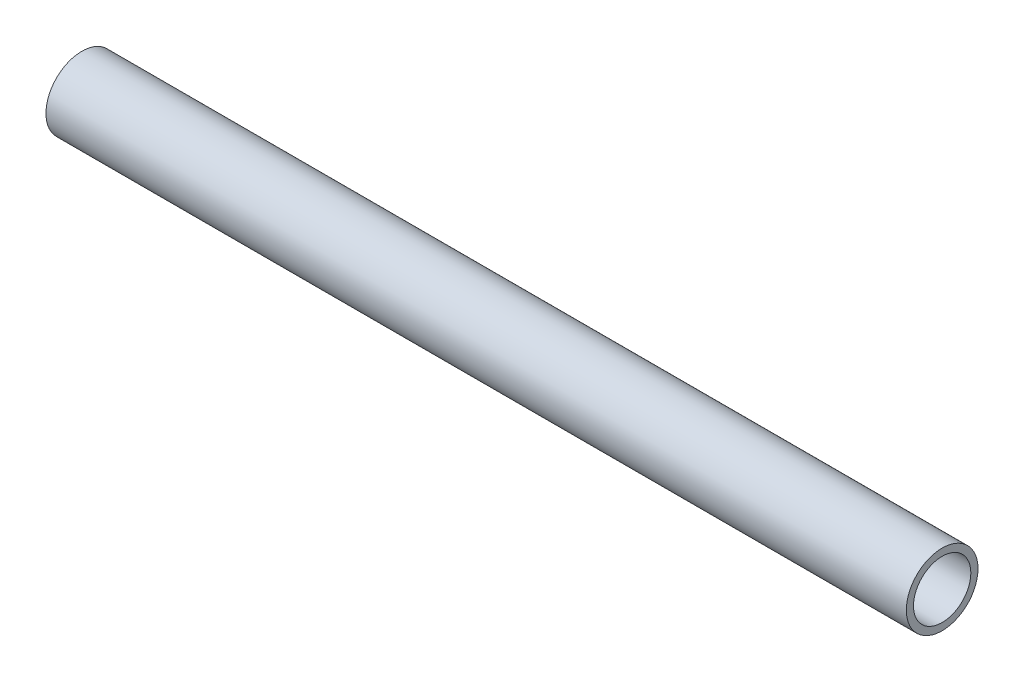
ISO-10303-21;
HEADER;
FILE_DESCRIPTION(('STEP AP214'),'2;1');
FILE_NAME('part.step','',(''),(''),'','','');
FILE_SCHEMA(('AUTOMOTIVE_DESIGN { 1 0 10303 214 1 1 1 1 }'));
ENDSEC;
DATA;
#1=APPLICATION_CONTEXT('core data for automotive mechanical design processes');
#2=APPLICATION_PROTOCOL_DEFINITION('international standard','automotive_design',2000,#1);
#3=PRODUCT_CONTEXT('',#1,'mechanical');
#4=PRODUCT('Part','Part','',(#3));
#5=PRODUCT_RELATED_PRODUCT_CATEGORY('part','',(#4));
#6=PRODUCT_DEFINITION_FORMATION('','',#4);
#7=PRODUCT_DEFINITION_CONTEXT('part definition',#1,'design');
#8=PRODUCT_DEFINITION('design','',#6,#7);
#9=PRODUCT_DEFINITION_SHAPE('','',#8);
#10=(LENGTH_UNIT() NAMED_UNIT(*) SI_UNIT(.MILLI.,.METRE.));
#11=(NAMED_UNIT(*) PLANE_ANGLE_UNIT() SI_UNIT($,.RADIAN.));
#12=(NAMED_UNIT(*) SI_UNIT($,.STERADIAN.) SOLID_ANGLE_UNIT());
#13=UNCERTAINTY_MEASURE_WITH_UNIT(LENGTH_MEASURE(1.E-05),#10,'distance_accuracy_value','');
#14=(GEOMETRIC_REPRESENTATION_CONTEXT(3) GLOBAL_UNCERTAINTY_ASSIGNED_CONTEXT((#13)) GLOBAL_UNIT_ASSIGNED_CONTEXT((#10,
#11,#12)) REPRESENTATION_CONTEXT('',''));
#15=CARTESIAN_POINT('',(0.,0.,0.));
#16=DIRECTION('',(0.,0.,1.));
#17=DIRECTION('',(1.,0.,0.));
#18=AXIS2_PLACEMENT_3D('',#15,#16,#17);
#19=CARTESIAN_POINT('',(0.,0.,0.));
#20=DIRECTION('',(1.,0.,0.));
#21=DIRECTION('',(0.,0.,-1.));
#22=AXIS2_PLACEMENT_3D('',#19,#20,#21);
#23=PLANE('',#22);
#24=CARTESIAN_POINT('',(0.,0.,0.));
#25=DIRECTION('',(1.,0.,0.));
#26=DIRECTION('',(0.,0.,-1.));
#27=AXIS2_PLACEMENT_3D('',#24,#25,#26);
#28=CIRCLE('',#27,4.);
#29=CARTESIAN_POINT('',(0.,0.,-4.));
#30=VERTEX_POINT('',#29);
#31=EDGE_CURVE('E57',#30,#30,#28,.T.);
#32=ORIENTED_EDGE('',*,*,#31,.T.);
#33=EDGE_LOOP('',(#32));
#34=FACE_BOUND('',#33,.T.);
#35=CARTESIAN_POINT('',(0.,0.,0.));
#36=DIRECTION('',(1.,0.,0.));
#37=DIRECTION('',(0.,0.,-1.));
#38=AXIS2_PLACEMENT_3D('',#35,#36,#37);
#39=CIRCLE('',#38,5.);
#40=CARTESIAN_POINT('',(0.,0.,-5.));
#41=VERTEX_POINT('',#40);
#42=EDGE_CURVE('E49',#41,#41,#39,.T.);
#43=ORIENTED_EDGE('',*,*,#42,.F.);
#44=EDGE_LOOP('',(#43));
#45=FACE_BOUND('',#44,.T.);
#46=ADVANCED_FACE('F43',(#34,#45),#23,.F.);
#47=CARTESIAN_POINT('',(120.,0.,0.));
#48=DIRECTION('',(1.,0.,0.));
#49=DIRECTION('',(0.,0.,-1.));
#50=AXIS2_PLACEMENT_3D('',#47,#48,#49);
#51=PLANE('',#50);
#52=CARTESIAN_POINT('',(120.,0.,0.));
#53=DIRECTION('',(1.,0.,0.));
#54=DIRECTION('',(0.,0.,-1.));
#55=AXIS2_PLACEMENT_3D('',#52,#53,#54);
#56=CIRCLE('',#55,4.);
#57=CARTESIAN_POINT('',(120.,0.,-4.));
#58=VERTEX_POINT('',#57);
#59=EDGE_CURVE('E53',#58,#58,#56,.T.);
#60=ORIENTED_EDGE('',*,*,#59,.F.);
#61=EDGE_LOOP('',(#60));
#62=FACE_BOUND('',#61,.T.);
#63=CARTESIAN_POINT('',(120.,0.,0.));
#64=DIRECTION('',(1.,0.,0.));
#65=DIRECTION('',(0.,0.,-1.));
#66=AXIS2_PLACEMENT_3D('',#63,#64,#65);
#67=CIRCLE('',#66,5.);
#68=CARTESIAN_POINT('',(120.,0.,-5.));
#69=VERTEX_POINT('',#68);
#70=EDGE_CURVE('E11',#69,#69,#67,.T.);
#71=ORIENTED_EDGE('',*,*,#70,.T.);
#72=EDGE_LOOP('',(#71));
#73=FACE_BOUND('',#72,.T.);
#74=ADVANCED_FACE('F73',(#62,#73),#51,.T.);
#75=CARTESIAN_POINT('',(0.,0.,0.));
#76=DIRECTION('',(1.,0.,0.));
#77=DIRECTION('',(0.,0.,-1.));
#78=AXIS2_PLACEMENT_3D('',#75,#76,#77);
#79=CYLINDRICAL_SURFACE('',#78,5.);
#80=ORIENTED_EDGE('',*,*,#70,.F.);
#81=EDGE_LOOP('',(#80));
#82=FACE_BOUND('',#81,.T.);
#83=ORIENTED_EDGE('',*,*,#42,.T.);
#84=EDGE_LOOP('',(#83));
#85=FACE_BOUND('',#84,.T.);
#86=ADVANCED_FACE('F67',(#82,#85),#79,.T.);
#87=CARTESIAN_POINT('',(0.,0.,0.));
#88=DIRECTION('',(1.,0.,0.));
#89=DIRECTION('',(0.,0.,-1.));
#90=AXIS2_PLACEMENT_3D('',#87,#88,#89);
#91=CYLINDRICAL_SURFACE('',#90,4.);
#92=ORIENTED_EDGE('',*,*,#59,.T.);
#93=EDGE_LOOP('',(#92));
#94=FACE_BOUND('',#93,.T.);
#95=ORIENTED_EDGE('',*,*,#31,.F.);
#96=EDGE_LOOP('',(#95));
#97=FACE_BOUND('',#96,.T.);
#98=ADVANCED_FACE('F65',(#94,#97),#91,.F.);
#99=CLOSED_SHELL('',(#46,#74,#86,#98));
#100=MANIFOLD_SOLID_BREP('B2',#99);
#101=ADVANCED_BREP_SHAPE_REPRESENTATION('',(#18,#100),#14);
#102=SHAPE_DEFINITION_REPRESENTATION(#9,#101);
ENDSEC;
END-ISO-10303-21;
